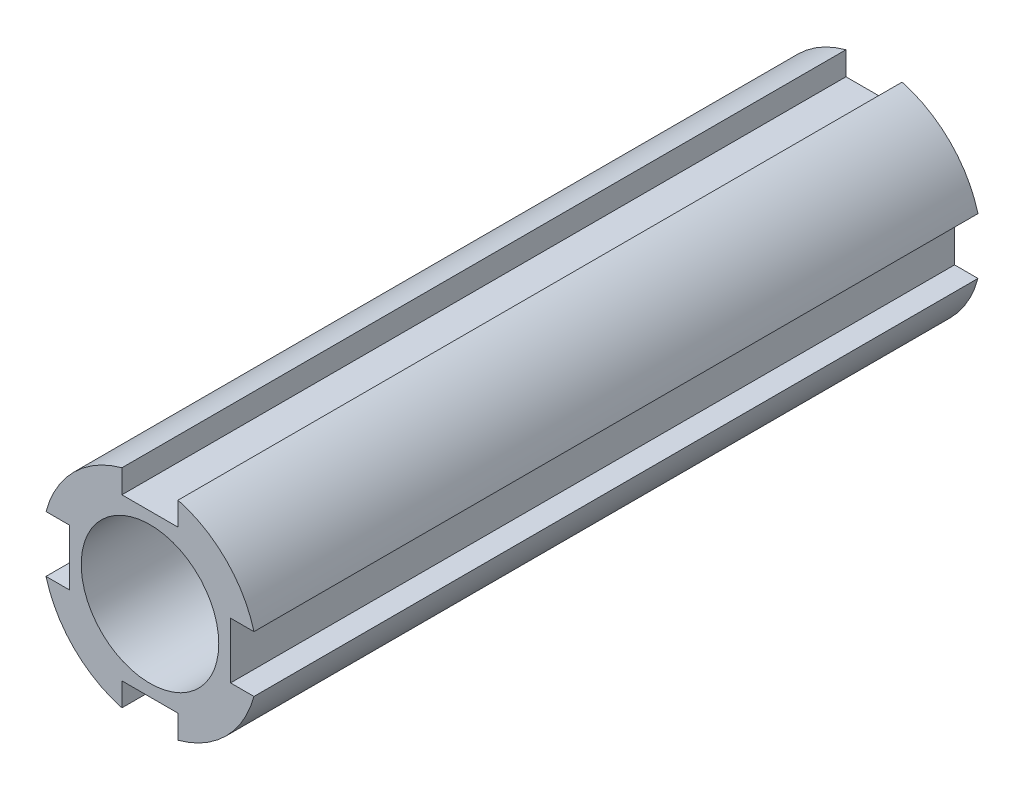
ISO-10303-21;
HEADER;
FILE_DESCRIPTION(('STEP AP214'),'2;1');
FILE_NAME('part.step','',(''),(''),'','','');
FILE_SCHEMA(('AUTOMOTIVE_DESIGN { 1 0 10303 214 1 1 1 1 }'));
ENDSEC;
DATA;
#1=APPLICATION_CONTEXT('core data for automotive mechanical design processes');
#2=APPLICATION_PROTOCOL_DEFINITION('international standard','automotive_design',2000,#1);
#3=PRODUCT_CONTEXT('',#1,'mechanical');
#4=PRODUCT('Part','Part','',(#3));
#5=PRODUCT_RELATED_PRODUCT_CATEGORY('part','',(#4));
#6=PRODUCT_DEFINITION_FORMATION('','',#4);
#7=PRODUCT_DEFINITION_CONTEXT('part definition',#1,'design');
#8=PRODUCT_DEFINITION('design','',#6,#7);
#9=PRODUCT_DEFINITION_SHAPE('','',#8);
#10=(LENGTH_UNIT() NAMED_UNIT(*) SI_UNIT(.MILLI.,.METRE.));
#11=(NAMED_UNIT(*) PLANE_ANGLE_UNIT() SI_UNIT($,.RADIAN.));
#12=(NAMED_UNIT(*) SI_UNIT($,.STERADIAN.) SOLID_ANGLE_UNIT());
#13=UNCERTAINTY_MEASURE_WITH_UNIT(LENGTH_MEASURE(1.E-05),#10,'distance_accuracy_value','');
#14=(GEOMETRIC_REPRESENTATION_CONTEXT(3) GLOBAL_UNCERTAINTY_ASSIGNED_CONTEXT((#13)) GLOBAL_UNIT_ASSIGNED_CONTEXT((#10,
#11,#12)) REPRESENTATION_CONTEXT('',''));
#15=CARTESIAN_POINT('',(0.,0.,0.));
#16=DIRECTION('',(0.,0.,1.));
#17=DIRECTION('',(1.,0.,0.));
#18=AXIS2_PLACEMENT_3D('',#15,#16,#17);
#19=CARTESIAN_POINT('',(1.1,-1.05,-20.));
#20=DIRECTION('',(1.,0.,0.));
#21=DIRECTION('',(0.,1.,0.));
#22=AXIS2_PLACEMENT_3D('',#19,#20,#21);
#23=PLANE('',#22);
#24=DIRECTION('',(0.,-1.,0.));
#25=VECTOR('',#24,1.);
#26=CARTESIAN_POINT('',(1.1,-1.05,12.));
#27=LINE('',#26,#25);
#28=CARTESIAN_POINT('',(1.1,-1.3,12.));
#29=VERTEX_POINT('',#28);
#30=CARTESIAN_POINT('',(1.1,-2.35,12.));
#31=VERTEX_POINT('',#30);
#32=EDGE_CURVE('E354',#29,#31,#27,.T.);
#33=ORIENTED_EDGE('',*,*,#32,.F.);
#34=DIRECTION('',(0.,0.,1.));
#35=VECTOR('',#34,1.);
#36=CARTESIAN_POINT('',(1.1,-1.3,-20.));
#37=LINE('',#36,#35);
#38=CARTESIAN_POINT('',(1.1,-1.3,-12.));
#39=VERTEX_POINT('',#38);
#40=EDGE_CURVE('E318',#29,#39,#37,.F.);
#41=ORIENTED_EDGE('',*,*,#40,.T.);
#42=DIRECTION('',(0.,1.,0.));
#43=VECTOR('',#42,1.);
#44=CARTESIAN_POINT('',(1.1,-1.05,-12.));
#45=LINE('',#44,#43);
#46=CARTESIAN_POINT('',(1.1,-2.35,-12.));
#47=VERTEX_POINT('',#46);
#48=EDGE_CURVE('E490',#47,#39,#45,.T.);
#49=ORIENTED_EDGE('',*,*,#48,.F.);
#50=DIRECTION('',(0.,0.,1.));
#51=VECTOR('',#50,1.);
#52=CARTESIAN_POINT('',(1.1,-2.35,-20.));
#53=LINE('',#52,#51);
#54=EDGE_CURVE('E453',#47,#31,#53,.T.);
#55=ORIENTED_EDGE('',*,*,#54,.T.);
#56=EDGE_LOOP('',(#33,#41,#49,#55));
#57=FACE_BOUND('',#56,.T.);
#58=ADVANCED_FACE('F41',(#57),#23,.F.);
#59=CARTESIAN_POINT('',(-1.,-2.35,-20.));
#60=DIRECTION('',(0.,-1.,0.));
#61=DIRECTION('',(0.,0.,-1.));
#62=AXIS2_PLACEMENT_3D('',#59,#60,#61);
#63=PLANE('',#62);
#64=DIRECTION('',(1.,0.,0.));
#65=VECTOR('',#64,1.);
#66=CARTESIAN_POINT('',(-1.,-2.35,-12.));
#67=LINE('',#66,#65);
#68=CARTESIAN_POINT('',(-1.,-2.35,-12.));
#69=VERTEX_POINT('',#68);
#70=EDGE_CURVE('E494',#69,#47,#67,.T.);
#71=ORIENTED_EDGE('',*,*,#70,.F.);
#72=DIRECTION('',(0.,0.,1.));
#73=VECTOR('',#72,1.);
#74=CARTESIAN_POINT('',(-1.,-2.35,-20.));
#75=LINE('',#74,#73);
#76=CARTESIAN_POINT('',(-1.,-2.35,12.));
#77=VERTEX_POINT('',#76);
#78=EDGE_CURVE('E456',#69,#77,#75,.T.);
#79=ORIENTED_EDGE('',*,*,#78,.T.);
#80=DIRECTION('',(-1.,0.,0.));
#81=VECTOR('',#80,1.);
#82=CARTESIAN_POINT('',(-1.,-2.35,12.));
#83=LINE('',#82,#81);
#84=EDGE_CURVE('E351',#31,#77,#83,.T.);
#85=ORIENTED_EDGE('',*,*,#84,.F.);
#86=ORIENTED_EDGE('',*,*,#54,.F.);
#87=EDGE_LOOP('',(#71,#79,#85,#86));
#88=FACE_BOUND('',#87,.T.);
#89=ADVANCED_FACE('F532',(#88),#63,.F.);
#90=CARTESIAN_POINT('',(-1.,-1.05,-20.));
#91=DIRECTION('',(-1.,0.,0.));
#92=DIRECTION('',(0.,0.,1.));
#93=AXIS2_PLACEMENT_3D('',#90,#91,#92);
#94=PLANE('',#93);
#95=DIRECTION('',(0.,-1.,0.));
#96=VECTOR('',#95,1.);
#97=CARTESIAN_POINT('',(-1.,-1.05,-12.));
#98=LINE('',#97,#96);
#99=CARTESIAN_POINT('',(-1.,-1.3,-12.));
#100=VERTEX_POINT('',#99);
#101=EDGE_CURVE('E496',#100,#69,#98,.T.);
#102=ORIENTED_EDGE('',*,*,#101,.F.);
#103=DIRECTION('',(0.,0.,1.));
#104=VECTOR('',#103,1.);
#105=CARTESIAN_POINT('',(-1.,-1.3,-20.));
#106=LINE('',#105,#104);
#107=CARTESIAN_POINT('',(-1.,-1.3,12.));
#108=VERTEX_POINT('',#107);
#109=EDGE_CURVE('E262',#100,#108,#106,.T.);
#110=ORIENTED_EDGE('',*,*,#109,.T.);
#111=DIRECTION('',(0.,1.,0.));
#112=VECTOR('',#111,1.);
#113=CARTESIAN_POINT('',(-1.,-1.05,12.));
#114=LINE('',#113,#112);
#115=EDGE_CURVE('E349',#77,#108,#114,.T.);
#116=ORIENTED_EDGE('',*,*,#115,.F.);
#117=ORIENTED_EDGE('',*,*,#78,.F.);
#118=EDGE_LOOP('',(#102,#110,#116,#117));
#119=FACE_BOUND('',#118,.T.);
#120=ADVANCED_FACE('F539',(#119),#94,.F.);
#121=CARTESIAN_POINT('',(-2.3,-1.05,-20.));
#122=DIRECTION('',(0.,-1.,0.));
#123=DIRECTION('',(0.,0.,-1.));
#124=AXIS2_PLACEMENT_3D('',#121,#122,#123);
#125=PLANE('',#124);
#126=DIRECTION('',(-1.,0.,0.));
#127=VECTOR('',#126,1.);
#128=CARTESIAN_POINT('',(-2.3,-1.05,12.));
#129=LINE('',#128,#127);
#130=CARTESIAN_POINT('',(-1.25,-1.05,12.));
#131=VERTEX_POINT('',#130);
#132=CARTESIAN_POINT('',(-2.3,-1.05,12.));
#133=VERTEX_POINT('',#132);
#134=EDGE_CURVE('E342',#131,#133,#129,.T.);
#135=ORIENTED_EDGE('',*,*,#134,.F.);
#136=DIRECTION('',(0.,0.,1.));
#137=VECTOR('',#136,1.);
#138=CARTESIAN_POINT('',(-1.25,-1.05,-20.));
#139=LINE('',#138,#137);
#140=CARTESIAN_POINT('',(-1.25,-1.05,-12.));
#141=VERTEX_POINT('',#140);
#142=EDGE_CURVE('E308',#131,#141,#139,.F.);
#143=ORIENTED_EDGE('',*,*,#142,.T.);
#144=DIRECTION('',(1.,0.,0.));
#145=VECTOR('',#144,1.);
#146=CARTESIAN_POINT('',(-2.3,-1.05,-12.));
#147=LINE('',#146,#145);
#148=CARTESIAN_POINT('',(-2.3,-1.05,-12.));
#149=VERTEX_POINT('',#148);
#150=EDGE_CURVE('E498',#149,#141,#147,.T.);
#151=ORIENTED_EDGE('',*,*,#150,.F.);
#152=DIRECTION('',(0.,0.,1.));
#153=VECTOR('',#152,1.);
#154=CARTESIAN_POINT('',(-2.3,-1.05,-20.));
#155=LINE('',#154,#153);
#156=EDGE_CURVE('E458',#149,#133,#155,.T.);
#157=ORIENTED_EDGE('',*,*,#156,.T.);
#158=EDGE_LOOP('',(#135,#143,#151,#157));
#159=FACE_BOUND('',#158,.T.);
#160=ADVANCED_FACE('F591',(#159),#125,.F.);
#161=CARTESIAN_POINT('',(-2.3,1.05,-20.));
#162=DIRECTION('',(-1.,0.,0.));
#163=DIRECTION('',(0.,-1.,0.));
#164=AXIS2_PLACEMENT_3D('',#161,#162,#163);
#165=PLANE('',#164);
#166=DIRECTION('',(0.,-1.,0.));
#167=VECTOR('',#166,1.);
#168=CARTESIAN_POINT('',(-2.3,1.05,-12.));
#169=LINE('',#168,#167);
#170=CARTESIAN_POINT('',(-2.3,1.05,-12.));
#171=VERTEX_POINT('',#170);
#172=EDGE_CURVE('E500',#171,#149,#169,.T.);
#173=ORIENTED_EDGE('',*,*,#172,.F.);
#174=DIRECTION('',(0.,0.,1.));
#175=VECTOR('',#174,1.);
#176=CARTESIAN_POINT('',(-2.3,1.05,-20.));
#177=LINE('',#176,#175);
#178=CARTESIAN_POINT('',(-2.3,1.05,12.));
#179=VERTEX_POINT('',#178);
#180=EDGE_CURVE('E461',#171,#179,#177,.T.);
#181=ORIENTED_EDGE('',*,*,#180,.T.);
#182=DIRECTION('',(0.,1.,0.));
#183=VECTOR('',#182,1.);
#184=CARTESIAN_POINT('',(-2.3,1.05,12.));
#185=LINE('',#184,#183);
#186=EDGE_CURVE('E339',#133,#179,#185,.T.);
#187=ORIENTED_EDGE('',*,*,#186,.F.);
#188=ORIENTED_EDGE('',*,*,#156,.F.);
#189=EDGE_LOOP('',(#173,#181,#187,#188));
#190=FACE_BOUND('',#189,.T.);
#191=ADVANCED_FACE('F596',(#190),#165,.F.);
#192=CARTESIAN_POINT('',(-2.3,1.05,-20.));
#193=DIRECTION('',(0.,1.,0.));
#194=DIRECTION('',(0.,0.,1.));
#195=AXIS2_PLACEMENT_3D('',#192,#193,#194);
#196=PLANE('',#195);
#197=DIRECTION('',(-1.,0.,0.));
#198=VECTOR('',#197,1.);
#199=CARTESIAN_POINT('',(-2.3,1.05,-12.));
#200=LINE('',#199,#198);
#201=CARTESIAN_POINT('',(-1.25,1.05,-12.));
#202=VERTEX_POINT('',#201);
#203=EDGE_CURVE('E332',#202,#171,#200,.T.);
#204=ORIENTED_EDGE('',*,*,#203,.F.);
#205=DIRECTION('',(0.,0.,1.));
#206=VECTOR('',#205,1.);
#207=CARTESIAN_POINT('',(-1.25,1.05,-20.));
#208=LINE('',#207,#206);
#209=CARTESIAN_POINT('',(-1.25,1.05,12.));
#210=VERTEX_POINT('',#209);
#211=EDGE_CURVE('E49',#202,#210,#208,.T.);
#212=ORIENTED_EDGE('',*,*,#211,.T.);
#213=DIRECTION('',(1.,0.,0.));
#214=VECTOR('',#213,1.);
#215=CARTESIAN_POINT('',(-2.3,1.05,12.));
#216=LINE('',#215,#214);
#217=EDGE_CURVE('E331',#179,#210,#216,.T.);
#218=ORIENTED_EDGE('',*,*,#217,.F.);
#219=ORIENTED_EDGE('',*,*,#180,.F.);
#220=EDGE_LOOP('',(#204,#212,#218,#219));
#221=FACE_BOUND('',#220,.T.);
#222=ADVANCED_FACE('F329',(#221),#196,.F.);
#223=CARTESIAN_POINT('',(-1.,2.35,-20.));
#224=DIRECTION('',(-1.,0.,0.));
#225=DIRECTION('',(0.,-1.,0.));
#226=AXIS2_PLACEMENT_3D('',#223,#224,#225);
#227=PLANE('',#226);
#228=DIRECTION('',(0.,1.,0.));
#229=VECTOR('',#228,1.);
#230=CARTESIAN_POINT('',(-1.,2.35,12.));
#231=LINE('',#230,#229);
#232=CARTESIAN_POINT('',(-1.,1.3,12.));
#233=VERTEX_POINT('',#232);
#234=CARTESIAN_POINT('',(-1.,2.35,12.));
#235=VERTEX_POINT('',#234);
#236=EDGE_CURVE('E340',#233,#235,#231,.T.);
#237=ORIENTED_EDGE('',*,*,#236,.F.);
#238=DIRECTION('',(0.,0.,1.));
#239=VECTOR('',#238,1.);
#240=CARTESIAN_POINT('',(-1.,1.3,-20.));
#241=LINE('',#240,#239);
#242=CARTESIAN_POINT('',(-1.,1.3,-12.));
#243=VERTEX_POINT('',#242);
#244=EDGE_CURVE('E11',#233,#243,#241,.F.);
#245=ORIENTED_EDGE('',*,*,#244,.T.);
#246=DIRECTION('',(0.,-1.,0.));
#247=VECTOR('',#246,1.);
#248=CARTESIAN_POINT('',(-1.,2.35,-12.));
#249=LINE('',#248,#247);
#250=CARTESIAN_POINT('',(-1.,2.35,-12.));
#251=VERTEX_POINT('',#250);
#252=EDGE_CURVE('E503',#251,#243,#249,.T.);
#253=ORIENTED_EDGE('',*,*,#252,.F.);
#254=DIRECTION('',(0.,0.,1.));
#255=VECTOR('',#254,1.);
#256=CARTESIAN_POINT('',(-1.,2.35,-20.));
#257=LINE('',#256,#255);
#258=EDGE_CURVE('E463',#251,#235,#257,.T.);
#259=ORIENTED_EDGE('',*,*,#258,.T.);
#260=EDGE_LOOP('',(#237,#245,#253,#259));
#261=FACE_BOUND('',#260,.T.);
#262=ADVANCED_FACE('F603',(#261),#227,.F.);
#263=CARTESIAN_POINT('',(-1.,2.35,-20.));
#264=DIRECTION('',(0.,1.,0.));
#265=DIRECTION('',(-1.,0.,0.));
#266=AXIS2_PLACEMENT_3D('',#263,#264,#265);
#267=PLANE('',#266);
#268=DIRECTION('',(-1.,0.,0.));
#269=VECTOR('',#268,1.);
#270=CARTESIAN_POINT('',(-1.,2.35,-12.));
#271=LINE('',#270,#269);
#272=CARTESIAN_POINT('',(1.1,2.35,-12.));
#273=VERTEX_POINT('',#272);
#274=EDGE_CURVE('E472',#273,#251,#271,.T.);
#275=ORIENTED_EDGE('',*,*,#274,.F.);
#276=DIRECTION('',(0.,0.,1.));
#277=VECTOR('',#276,1.);
#278=CARTESIAN_POINT('',(1.1,2.35,-20.));
#279=LINE('',#278,#277);
#280=CARTESIAN_POINT('',(1.1,2.35,12.));
#281=VERTEX_POINT('',#280);
#282=EDGE_CURVE('E281',#273,#281,#279,.T.);
#283=ORIENTED_EDGE('',*,*,#282,.T.);
#284=DIRECTION('',(1.,0.,0.));
#285=VECTOR('',#284,1.);
#286=CARTESIAN_POINT('',(-1.,2.35,12.));
#287=LINE('',#286,#285);
#288=EDGE_CURVE('E344',#235,#281,#287,.T.);
#289=ORIENTED_EDGE('',*,*,#288,.F.);
#290=ORIENTED_EDGE('',*,*,#258,.F.);
#291=EDGE_LOOP('',(#275,#283,#289,#290));
#292=FACE_BOUND('',#291,.T.);
#293=ADVANCED_FACE('F470',(#292),#267,.F.);
#294=CARTESIAN_POINT('',(1.1,2.35,-20.));
#295=DIRECTION('',(1.,0.,0.));
#296=DIRECTION('',(0.,1.,0.));
#297=AXIS2_PLACEMENT_3D('',#294,#295,#296);
#298=PLANE('',#297);
#299=DIRECTION('',(0.,1.,0.));
#300=VECTOR('',#299,1.);
#301=CARTESIAN_POINT('',(1.1,2.35,-12.));
#302=LINE('',#301,#300);
#303=CARTESIAN_POINT('',(1.1,1.3,-12.));
#304=VERTEX_POINT('',#303);
#305=EDGE_CURVE('E506',#304,#273,#302,.T.);
#306=ORIENTED_EDGE('',*,*,#305,.F.);
#307=DIRECTION('',(0.,0.,1.));
#308=VECTOR('',#307,1.);
#309=CARTESIAN_POINT('',(1.1,1.3,-20.));
#310=LINE('',#309,#308);
#311=CARTESIAN_POINT('',(1.1,1.3,12.));
#312=VERTEX_POINT('',#311);
#313=EDGE_CURVE('E320',#304,#312,#310,.T.);
#314=ORIENTED_EDGE('',*,*,#313,.T.);
#315=DIRECTION('',(0.,-1.,0.));
#316=VECTOR('',#315,1.);
#317=CARTESIAN_POINT('',(1.1,2.35,12.));
#318=LINE('',#317,#316);
#319=EDGE_CURVE('E477',#281,#312,#318,.T.);
#320=ORIENTED_EDGE('',*,*,#319,.F.);
#321=ORIENTED_EDGE('',*,*,#282,.F.);
#322=EDGE_LOOP('',(#306,#314,#320,#321));
#323=FACE_BOUND('',#322,.T.);
#324=ADVANCED_FACE('F478',(#323),#298,.F.);
#325=CARTESIAN_POINT('',(1.1,1.05,-20.));
#326=DIRECTION('',(0.,1.,0.));
#327=DIRECTION('',(0.,0.,1.));
#328=AXIS2_PLACEMENT_3D('',#325,#326,#327);
#329=PLANE('',#328);
#330=DIRECTION('',(1.,0.,0.));
#331=VECTOR('',#330,1.);
#332=CARTESIAN_POINT('',(1.1,1.05,12.));
#333=LINE('',#332,#331);
#334=CARTESIAN_POINT('',(1.35,1.05,12.));
#335=VERTEX_POINT('',#334);
#336=CARTESIAN_POINT('',(2.4,1.05,12.));
#337=VERTEX_POINT('',#336);
#338=EDGE_CURVE('E480',#335,#337,#333,.T.);
#339=ORIENTED_EDGE('',*,*,#338,.F.);
#340=DIRECTION('',(0.,0.,1.));
#341=VECTOR('',#340,1.);
#342=CARTESIAN_POINT('',(1.35,1.05,-20.));
#343=LINE('',#342,#341);
#344=CARTESIAN_POINT('',(1.35,1.05,-12.));
#345=VERTEX_POINT('',#344);
#346=EDGE_CURVE('E323',#335,#345,#343,.F.);
#347=ORIENTED_EDGE('',*,*,#346,.T.);
#348=DIRECTION('',(-1.,0.,0.));
#349=VECTOR('',#348,1.);
#350=CARTESIAN_POINT('',(1.1,1.05,-12.));
#351=LINE('',#350,#349);
#352=CARTESIAN_POINT('',(2.4,1.05,-12.));
#353=VERTEX_POINT('',#352);
#354=EDGE_CURVE('E273',#353,#345,#351,.T.);
#355=ORIENTED_EDGE('',*,*,#354,.F.);
#356=DIRECTION('',(0.,0.,1.));
#357=VECTOR('',#356,1.);
#358=CARTESIAN_POINT('',(2.4,1.05,-20.));
#359=LINE('',#358,#357);
#360=EDGE_CURVE('E272',#353,#337,#359,.T.);
#361=ORIENTED_EDGE('',*,*,#360,.T.);
#362=EDGE_LOOP('',(#339,#347,#355,#361));
#363=FACE_BOUND('',#362,.T.);
#364=ADVANCED_FACE('F576',(#363),#329,.F.);
#365=CARTESIAN_POINT('',(2.4,1.05,-20.));
#366=DIRECTION('',(1.,0.,0.));
#367=DIRECTION('',(0.,1.,0.));
#368=AXIS2_PLACEMENT_3D('',#365,#366,#367);
#369=PLANE('',#368);
#370=DIRECTION('',(0.,1.,0.));
#371=VECTOR('',#370,1.);
#372=CARTESIAN_POINT('',(2.4,1.05,-12.));
#373=LINE('',#372,#371);
#374=CARTESIAN_POINT('',(2.4,-1.05,-12.));
#375=VERTEX_POINT('',#374);
#376=EDGE_CURVE('E253',#375,#353,#373,.T.);
#377=ORIENTED_EDGE('',*,*,#376,.F.);
#378=DIRECTION('',(0.,0.,1.));
#379=VECTOR('',#378,1.);
#380=CARTESIAN_POINT('',(2.4,-1.05,-20.));
#381=LINE('',#380,#379);
#382=CARTESIAN_POINT('',(2.4,-1.05,12.));
#383=VERTEX_POINT('',#382);
#384=EDGE_CURVE('E269',#375,#383,#381,.T.);
#385=ORIENTED_EDGE('',*,*,#384,.T.);
#386=DIRECTION('',(0.,-1.,0.));
#387=VECTOR('',#386,1.);
#388=CARTESIAN_POINT('',(2.4,1.05,12.));
#389=LINE('',#388,#387);
#390=EDGE_CURVE('E482',#337,#383,#389,.T.);
#391=ORIENTED_EDGE('',*,*,#390,.F.);
#392=ORIENTED_EDGE('',*,*,#360,.F.);
#393=EDGE_LOOP('',(#377,#385,#391,#392));
#394=FACE_BOUND('',#393,.T.);
#395=ADVANCED_FACE('F267',(#394),#369,.F.);
#396=CARTESIAN_POINT('',(1.1,-1.05,-20.));
#397=DIRECTION('',(0.,-1.,0.));
#398=DIRECTION('',(0.,0.,-1.));
#399=AXIS2_PLACEMENT_3D('',#396,#397,#398);
#400=PLANE('',#399);
#401=DIRECTION('',(1.,0.,0.));
#402=VECTOR('',#401,1.);
#403=CARTESIAN_POINT('',(1.1,-1.05,-12.));
#404=LINE('',#403,#402);
#405=CARTESIAN_POINT('',(1.35,-1.05,-12.));
#406=VERTEX_POINT('',#405);
#407=EDGE_CURVE('E248',#406,#375,#404,.T.);
#408=ORIENTED_EDGE('',*,*,#407,.F.);
#409=DIRECTION('',(0.,0.,1.));
#410=VECTOR('',#409,1.);
#411=CARTESIAN_POINT('',(1.35,-1.05,-20.));
#412=LINE('',#411,#410);
#413=CARTESIAN_POINT('',(1.35,-1.05,12.));
#414=VERTEX_POINT('',#413);
#415=EDGE_CURVE('E316',#406,#414,#412,.T.);
#416=ORIENTED_EDGE('',*,*,#415,.T.);
#417=DIRECTION('',(-1.,0.,0.));
#418=VECTOR('',#417,1.);
#419=CARTESIAN_POINT('',(1.1,-1.05,12.));
#420=LINE('',#419,#418);
#421=EDGE_CURVE('E263',#383,#414,#420,.T.);
#422=ORIENTED_EDGE('',*,*,#421,.F.);
#423=ORIENTED_EDGE('',*,*,#384,.F.);
#424=EDGE_LOOP('',(#408,#416,#422,#423));
#425=FACE_BOUND('',#424,.T.);
#426=ADVANCED_FACE('F277',(#425),#400,.F.);
#427=CARTESIAN_POINT('',(0.,0.,20.));
#428=DIRECTION('',(0.,0.,-1.));
#429=DIRECTION('',(-1.,0.,0.));
#430=AXIS2_PLACEMENT_3D('',#427,#428,#429);
#431=CYLINDRICAL_SURFACE('',#430,5.95);
#432=DIRECTION('',(0.,0.,1.));
#433=VECTOR('',#432,1.);
#434=CARTESIAN_POINT('',(1.55,5.74456264653803,-20.));
#435=LINE('',#434,#433);
#436=CARTESIAN_POINT('',(1.55,5.74456264653803,-20.));
#437=VERTEX_POINT('',#436);
#438=CARTESIAN_POINT('',(1.55,5.74456264653803,20.));
#439=VERTEX_POINT('',#438);
#440=EDGE_CURVE('E366',#437,#439,#435,.T.);
#441=ORIENTED_EDGE('',*,*,#440,.T.);
#442=CARTESIAN_POINT('',(0.,0.,20.));
#443=DIRECTION('',(0.,0.,1.));
#444=DIRECTION('',(1.,0.,0.));
#445=AXIS2_PLACEMENT_3D('',#442,#443,#444);
#446=CIRCLE('',#445,5.95);
#447=CARTESIAN_POINT('',(5.74456264653803,1.55,20.));
#448=VERTEX_POINT('',#447);
#449=EDGE_CURVE('E287',#448,#439,#446,.T.);
#450=ORIENTED_EDGE('',*,*,#449,.F.);
#451=DIRECTION('',(0.,0.,1.));
#452=VECTOR('',#451,1.);
#453=CARTESIAN_POINT('',(5.74456264653803,1.55,-20.));
#454=LINE('',#453,#452);
#455=CARTESIAN_POINT('',(5.74456264653803,1.55,-20.));
#456=VERTEX_POINT('',#455);
#457=EDGE_CURVE('E400',#456,#448,#454,.T.);
#458=ORIENTED_EDGE('',*,*,#457,.F.);
#459=CARTESIAN_POINT('',(0.,0.,-20.));
#460=DIRECTION('',(0.,0.,1.));
#461=DIRECTION('',(1.,0.,0.));
#462=AXIS2_PLACEMENT_3D('',#459,#460,#461);
#463=CIRCLE('',#462,5.95);
#464=EDGE_CURVE('E292',#456,#437,#463,.T.);
#465=ORIENTED_EDGE('',*,*,#464,.T.);
#466=EDGE_LOOP('',(#441,#450,#458,#465));
#467=FACE_BOUND('',#466,.T.);
#468=ADVANCED_FACE('F556',(#467),#431,.T.);
#469=CARTESIAN_POINT('',(-1.55,5.74456264653803,20.));
#470=VERTEX_POINT('',#469);
#471=CARTESIAN_POINT('',(-5.74456264653803,1.55,20.));
#472=VERTEX_POINT('',#471);
#473=EDGE_CURVE('E290',#470,#472,#446,.T.);
#474=ORIENTED_EDGE('',*,*,#473,.F.);
#475=DIRECTION('',(0.,0.,1.));
#476=VECTOR('',#475,1.);
#477=CARTESIAN_POINT('',(-1.55,5.74456264653803,-20.));
#478=LINE('',#477,#476);
#479=CARTESIAN_POINT('',(-1.55,5.74456264653803,-20.));
#480=VERTEX_POINT('',#479);
#481=EDGE_CURVE('E377',#480,#470,#478,.T.);
#482=ORIENTED_EDGE('',*,*,#481,.F.);
#483=CARTESIAN_POINT('',(-5.74456264653803,1.55,-20.));
#484=VERTEX_POINT('',#483);
#485=EDGE_CURVE('E295',#480,#484,#463,.T.);
#486=ORIENTED_EDGE('',*,*,#485,.T.);
#487=DIRECTION('',(0.,0.,1.));
#488=VECTOR('',#487,1.);
#489=CARTESIAN_POINT('',(-5.74456264653803,1.55,-20.));
#490=LINE('',#489,#488);
#491=EDGE_CURVE('E427',#484,#472,#490,.T.);
#492=ORIENTED_EDGE('',*,*,#491,.T.);
#493=EDGE_LOOP('',(#474,#482,#486,#492));
#494=FACE_BOUND('',#493,.T.);
#495=ADVANCED_FACE('F559',(#494),#431,.T.);
#496=CARTESIAN_POINT('',(1.55,-5.74456264653803,-20.));
#497=VERTEX_POINT('',#496);
#498=CARTESIAN_POINT('',(5.74456264653803,-1.55,-20.));
#499=VERTEX_POINT('',#498);
#500=EDGE_CURVE('E296',#497,#499,#463,.T.);
#501=ORIENTED_EDGE('',*,*,#500,.T.);
#502=DIRECTION('',(0.,0.,1.));
#503=VECTOR('',#502,1.);
#504=CARTESIAN_POINT('',(5.74456264653803,-1.55,-20.));
#505=LINE('',#504,#503);
#506=CARTESIAN_POINT('',(5.74456264653803,-1.55,20.));
#507=VERTEX_POINT('',#506);
#508=EDGE_CURVE('E402',#499,#507,#505,.T.);
#509=ORIENTED_EDGE('',*,*,#508,.T.);
#510=CARTESIAN_POINT('',(1.55,-5.74456264653803,20.));
#511=VERTEX_POINT('',#510);
#512=EDGE_CURVE('E291',#511,#507,#446,.T.);
#513=ORIENTED_EDGE('',*,*,#512,.F.);
#514=DIRECTION('',(0.,0.,1.));
#515=VECTOR('',#514,1.);
#516=CARTESIAN_POINT('',(1.55,-5.74456264653803,-20.));
#517=LINE('',#516,#515);
#518=EDGE_CURVE('E419',#497,#511,#517,.T.);
#519=ORIENTED_EDGE('',*,*,#518,.F.);
#520=EDGE_LOOP('',(#501,#509,#513,#519));
#521=FACE_BOUND('',#520,.T.);
#522=ADVANCED_FACE('F711',(#521),#431,.T.);
#523=CARTESIAN_POINT('',(-5.74456264653803,-1.55,20.));
#524=VERTEX_POINT('',#523);
#525=CARTESIAN_POINT('',(-1.55,-5.74456264653803,20.));
#526=VERTEX_POINT('',#525);
#527=EDGE_CURVE('E893',#524,#526,#446,.T.);
#528=ORIENTED_EDGE('',*,*,#527,.F.);
#529=DIRECTION('',(0.,0.,1.));
#530=VECTOR('',#529,1.);
#531=CARTESIAN_POINT('',(-5.74456264653803,-1.55,-20.));
#532=LINE('',#531,#530);
#533=CARTESIAN_POINT('',(-5.74456264653803,-1.55,-20.));
#534=VERTEX_POINT('',#533);
#535=EDGE_CURVE('E425',#534,#524,#532,.T.);
#536=ORIENTED_EDGE('',*,*,#535,.F.);
#537=CARTESIAN_POINT('',(-1.55,-5.74456264653803,-20.));
#538=VERTEX_POINT('',#537);
#539=EDGE_CURVE('E914',#534,#538,#463,.T.);
#540=ORIENTED_EDGE('',*,*,#539,.T.);
#541=DIRECTION('',(0.,0.,1.));
#542=VECTOR('',#541,1.);
#543=CARTESIAN_POINT('',(-1.55,-5.74456264653803,-20.));
#544=LINE('',#543,#542);
#545=EDGE_CURVE('E447',#538,#526,#544,.T.);
#546=ORIENTED_EDGE('',*,*,#545,.T.);
#547=EDGE_LOOP('',(#528,#536,#540,#546));
#548=FACE_BOUND('',#547,.T.);
#549=ADVANCED_FACE('F550',(#548),#431,.T.);
#550=CARTESIAN_POINT('',(0.,0.,20.));
#551=DIRECTION('',(0.,0.,1.));
#552=DIRECTION('',(1.,0.,0.));
#553=AXIS2_PLACEMENT_3D('',#550,#551,#552);
#554=PLANE('',#553);
#555=CARTESIAN_POINT('',(0.,0.,20.));
#556=DIRECTION('',(0.,0.,1.));
#557=DIRECTION('',(1.,0.,0.));
#558=AXIS2_PLACEMENT_3D('',#555,#556,#557);
#559=CIRCLE('',#558,3.8);
#560=CARTESIAN_POINT('',(3.8,0.,20.));
#561=VERTEX_POINT('',#560);
#562=EDGE_CURVE('E487',#561,#561,#559,.T.);
#563=ORIENTED_EDGE('',*,*,#562,.F.);
#564=EDGE_LOOP('',(#563));
#565=FACE_BOUND('',#564,.T.);
#566=ORIENTED_EDGE('',*,*,#449,.T.);
#567=DIRECTION('',(0.,-1.,0.));
#568=VECTOR('',#567,1.);
#569=CARTESIAN_POINT('',(1.55,0.,20.));
#570=LINE('',#569,#568);
#571=CARTESIAN_POINT('',(1.55,4.45,20.));
#572=VERTEX_POINT('',#571);
#573=EDGE_CURVE('E367',#439,#572,#570,.T.);
#574=ORIENTED_EDGE('',*,*,#573,.T.);
#575=DIRECTION('',(1.,0.,0.));
#576=VECTOR('',#575,1.);
#577=CARTESIAN_POINT('',(0.,4.45,20.));
#578=LINE('',#577,#576);
#579=CARTESIAN_POINT('',(-1.55,4.45,20.));
#580=VERTEX_POINT('',#579);
#581=EDGE_CURVE('E360',#580,#572,#578,.T.);
#582=ORIENTED_EDGE('',*,*,#581,.F.);
#583=DIRECTION('',(0.,-1.,0.));
#584=VECTOR('',#583,1.);
#585=CARTESIAN_POINT('',(-1.55,0.,20.));
#586=LINE('',#585,#584);
#587=EDGE_CURVE('E370',#470,#580,#586,.T.);
#588=ORIENTED_EDGE('',*,*,#587,.F.);
#589=ORIENTED_EDGE('',*,*,#473,.T.);
#590=DIRECTION('',(1.,0.,0.));
#591=VECTOR('',#590,1.);
#592=CARTESIAN_POINT('',(0.,1.55,20.));
#593=LINE('',#592,#591);
#594=CARTESIAN_POINT('',(-4.45,1.55,20.));
#595=VERTEX_POINT('',#594);
#596=EDGE_CURVE('E418',#472,#595,#593,.T.);
#597=ORIENTED_EDGE('',*,*,#596,.T.);
#598=DIRECTION('',(0.,-1.,0.));
#599=VECTOR('',#598,1.);
#600=CARTESIAN_POINT('',(-4.45,0.,20.));
#601=LINE('',#600,#599);
#602=CARTESIAN_POINT('',(-4.45,-1.55,20.));
#603=VERTEX_POINT('',#602);
#604=EDGE_CURVE('E415',#595,#603,#601,.T.);
#605=ORIENTED_EDGE('',*,*,#604,.T.);
#606=DIRECTION('',(1.,0.,0.));
#607=VECTOR('',#606,1.);
#608=CARTESIAN_POINT('',(0.,-1.55,20.));
#609=LINE('',#608,#607);
#610=EDGE_CURVE('E409',#524,#603,#609,.T.);
#611=ORIENTED_EDGE('',*,*,#610,.F.);
#612=ORIENTED_EDGE('',*,*,#527,.T.);
#613=DIRECTION('',(0.,-1.,0.));
#614=VECTOR('',#613,1.);
#615=CARTESIAN_POINT('',(-1.55,0.,20.));
#616=LINE('',#615,#614);
#617=CARTESIAN_POINT('',(-1.55,-4.45,20.));
#618=VERTEX_POINT('',#617);
#619=EDGE_CURVE('E434',#618,#526,#616,.T.);
#620=ORIENTED_EDGE('',*,*,#619,.F.);
#621=DIRECTION('',(1.,0.,0.));
#622=VECTOR('',#621,1.);
#623=CARTESIAN_POINT('',(0.,-4.45,20.));
#624=LINE('',#623,#622);
#625=CARTESIAN_POINT('',(1.55,-4.45,20.));
#626=VERTEX_POINT('',#625);
#627=EDGE_CURVE('E442',#618,#626,#624,.T.);
#628=ORIENTED_EDGE('',*,*,#627,.T.);
#629=DIRECTION('',(0.,-1.,0.));
#630=VECTOR('',#629,1.);
#631=CARTESIAN_POINT('',(1.55,0.,20.));
#632=LINE('',#631,#630);
#633=EDGE_CURVE('E356',#626,#511,#632,.T.);
#634=ORIENTED_EDGE('',*,*,#633,.T.);
#635=ORIENTED_EDGE('',*,*,#512,.T.);
#636=DIRECTION('',(1.,0.,0.));
#637=VECTOR('',#636,1.);
#638=CARTESIAN_POINT('',(0.,-1.55,20.));
#639=LINE('',#638,#637);
#640=CARTESIAN_POINT('',(4.45,-1.55,20.));
#641=VERTEX_POINT('',#640);
#642=EDGE_CURVE('E394',#641,#507,#639,.T.);
#643=ORIENTED_EDGE('',*,*,#642,.F.);
#644=DIRECTION('',(0.,-1.,0.));
#645=VECTOR('',#644,1.);
#646=CARTESIAN_POINT('',(4.45,0.,20.));
#647=LINE('',#646,#645);
#648=CARTESIAN_POINT('',(4.45,1.55,20.));
#649=VERTEX_POINT('',#648);
#650=EDGE_CURVE('E391',#649,#641,#647,.T.);
#651=ORIENTED_EDGE('',*,*,#650,.F.);
#652=DIRECTION('',(1.,0.,0.));
#653=VECTOR('',#652,1.);
#654=CARTESIAN_POINT('',(0.,1.55,20.));
#655=LINE('',#654,#653);
#656=EDGE_CURVE('E385',#649,#448,#655,.T.);
#657=ORIENTED_EDGE('',*,*,#656,.T.);
#658=EDGE_LOOP('',(#566,#574,#582,#588,#589,#597,#605,#611,#612,#620,#628,#634,#635,#643,#651,#657));
#659=FACE_BOUND('',#658,.T.);
#660=ADVANCED_FACE('F546',(#565,#659),#554,.T.);
#661=CARTESIAN_POINT('',(0.,0.,-20.));
#662=DIRECTION('',(0.,0.,1.));
#663=DIRECTION('',(1.,0.,0.));
#664=AXIS2_PLACEMENT_3D('',#661,#662,#663);
#665=PLANE('',#664);
#666=CARTESIAN_POINT('',(0.,0.,-20.));
#667=DIRECTION('',(0.,0.,1.));
#668=DIRECTION('',(1.,0.,0.));
#669=AXIS2_PLACEMENT_3D('',#666,#667,#668);
#670=CIRCLE('',#669,3.8);
#671=CARTESIAN_POINT('',(3.8,0.,-20.));
#672=VERTEX_POINT('',#671);
#673=EDGE_CURVE('E509',#672,#672,#670,.T.);
#674=ORIENTED_EDGE('',*,*,#673,.T.);
#675=EDGE_LOOP('',(#674));
#676=FACE_BOUND('',#675,.T.);
#677=DIRECTION('',(0.,-1.,0.));
#678=VECTOR('',#677,1.);
#679=CARTESIAN_POINT('',(1.55,0.,-20.));
#680=LINE('',#679,#678);
#681=CARTESIAN_POINT('',(1.55,4.45,-20.));
#682=VERTEX_POINT('',#681);
#683=EDGE_CURVE('E357',#437,#682,#680,.T.);
#684=ORIENTED_EDGE('',*,*,#683,.F.);
#685=ORIENTED_EDGE('',*,*,#464,.F.);
#686=DIRECTION('',(1.,0.,0.));
#687=VECTOR('',#686,1.);
#688=CARTESIAN_POINT('',(0.,1.55,-20.));
#689=LINE('',#688,#687);
#690=CARTESIAN_POINT('',(4.45,1.55,-20.));
#691=VERTEX_POINT('',#690);
#692=EDGE_CURVE('E388',#691,#456,#689,.T.);
#693=ORIENTED_EDGE('',*,*,#692,.F.);
#694=DIRECTION('',(0.,-1.,0.));
#695=VECTOR('',#694,1.);
#696=CARTESIAN_POINT('',(4.45,0.,-20.));
#697=LINE('',#696,#695);
#698=CARTESIAN_POINT('',(4.45,-1.55,-20.));
#699=VERTEX_POINT('',#698);
#700=EDGE_CURVE('E381',#691,#699,#697,.T.);
#701=ORIENTED_EDGE('',*,*,#700,.T.);
#702=DIRECTION('',(1.,0.,0.));
#703=VECTOR('',#702,1.);
#704=CARTESIAN_POINT('',(0.,-1.55,-20.));
#705=LINE('',#704,#703);
#706=EDGE_CURVE('E384',#699,#499,#705,.T.);
#707=ORIENTED_EDGE('',*,*,#706,.T.);
#708=ORIENTED_EDGE('',*,*,#500,.F.);
#709=DIRECTION('',(0.,-1.,0.));
#710=VECTOR('',#709,1.);
#711=CARTESIAN_POINT('',(1.55,0.,-20.));
#712=LINE('',#711,#710);
#713=CARTESIAN_POINT('',(1.55,-4.45,-20.));
#714=VERTEX_POINT('',#713);
#715=EDGE_CURVE('E431',#714,#497,#712,.T.);
#716=ORIENTED_EDGE('',*,*,#715,.F.);
#717=DIRECTION('',(1.,0.,0.));
#718=VECTOR('',#717,1.);
#719=CARTESIAN_POINT('',(0.,-4.45,-20.));
#720=LINE('',#719,#718);
#721=CARTESIAN_POINT('',(-1.55,-4.45,-20.));
#722=VERTEX_POINT('',#721);
#723=EDGE_CURVE('E433',#722,#714,#720,.T.);
#724=ORIENTED_EDGE('',*,*,#723,.F.);
#725=DIRECTION('',(0.,-1.,0.));
#726=VECTOR('',#725,1.);
#727=CARTESIAN_POINT('',(-1.55,0.,-20.));
#728=LINE('',#727,#726);
#729=EDGE_CURVE('E436',#722,#538,#728,.T.);
#730=ORIENTED_EDGE('',*,*,#729,.T.);
#731=ORIENTED_EDGE('',*,*,#539,.F.);
#732=DIRECTION('',(1.,0.,0.));
#733=VECTOR('',#732,1.);
#734=CARTESIAN_POINT('',(0.,-1.55,-20.));
#735=LINE('',#734,#733);
#736=CARTESIAN_POINT('',(-4.45,-1.55,-20.));
#737=VERTEX_POINT('',#736);
#738=EDGE_CURVE('E411',#534,#737,#735,.T.);
#739=ORIENTED_EDGE('',*,*,#738,.T.);
#740=DIRECTION('',(0.,-1.,0.));
#741=VECTOR('',#740,1.);
#742=CARTESIAN_POINT('',(-4.45,0.,-20.));
#743=LINE('',#742,#741);
#744=CARTESIAN_POINT('',(-4.45,1.55,-20.));
#745=VERTEX_POINT('',#744);
#746=EDGE_CURVE('E406',#745,#737,#743,.T.);
#747=ORIENTED_EDGE('',*,*,#746,.F.);
#748=DIRECTION('',(1.,0.,0.));
#749=VECTOR('',#748,1.);
#750=CARTESIAN_POINT('',(0.,1.55,-20.));
#751=LINE('',#750,#749);
#752=EDGE_CURVE('E408',#484,#745,#751,.T.);
#753=ORIENTED_EDGE('',*,*,#752,.F.);
#754=ORIENTED_EDGE('',*,*,#485,.F.);
#755=DIRECTION('',(0.,-1.,0.));
#756=VECTOR('',#755,1.);
#757=CARTESIAN_POINT('',(-1.55,0.,-20.));
#758=LINE('',#757,#756);
#759=CARTESIAN_POINT('',(-1.55,4.45,-20.));
#760=VERTEX_POINT('',#759);
#761=EDGE_CURVE('E359',#480,#760,#758,.T.);
#762=ORIENTED_EDGE('',*,*,#761,.T.);
#763=DIRECTION('',(1.,0.,0.));
#764=VECTOR('',#763,1.);
#765=CARTESIAN_POINT('',(0.,4.45,-20.));
#766=LINE('',#765,#764);
#767=EDGE_CURVE('E363',#760,#682,#766,.T.);
#768=ORIENTED_EDGE('',*,*,#767,.T.);
#769=EDGE_LOOP('',(#684,#685,#693,#701,#707,#708,#716,#724,#730,#731,#739,#747,#753,#754,#762,#768));
#770=FACE_BOUND('',#769,.T.);
#771=ADVANCED_FACE('F549',(#676,#770),#665,.F.);
#772=CARTESIAN_POINT('',(1.55,0.,-20.));
#773=DIRECTION('',(-1.,0.,0.));
#774=DIRECTION('',(0.,0.,1.));
#775=AXIS2_PLACEMENT_3D('',#772,#773,#774);
#776=PLANE('',#775);
#777=ORIENTED_EDGE('',*,*,#633,.F.);
#778=DIRECTION('',(0.,0.,1.));
#779=VECTOR('',#778,1.);
#780=CARTESIAN_POINT('',(1.55,-4.45,-20.));
#781=LINE('',#780,#779);
#782=EDGE_CURVE('E439',#714,#626,#781,.T.);
#783=ORIENTED_EDGE('',*,*,#782,.F.);
#784=ORIENTED_EDGE('',*,*,#715,.T.);
#785=ORIENTED_EDGE('',*,*,#518,.T.);
#786=EDGE_LOOP('',(#777,#783,#784,#785));
#787=FACE_BOUND('',#786,.T.);
#788=ADVANCED_FACE('F554',(#787),#776,.T.);
#789=CARTESIAN_POINT('',(-1.55,0.,-20.));
#790=DIRECTION('',(-1.,0.,0.));
#791=DIRECTION('',(0.,0.,1.));
#792=AXIS2_PLACEMENT_3D('',#789,#790,#791);
#793=PLANE('',#792);
#794=ORIENTED_EDGE('',*,*,#619,.T.);
#795=ORIENTED_EDGE('',*,*,#545,.F.);
#796=ORIENTED_EDGE('',*,*,#729,.F.);
#797=DIRECTION('',(0.,0.,1.));
#798=VECTOR('',#797,1.);
#799=CARTESIAN_POINT('',(-1.55,-4.45,-20.));
#800=LINE('',#799,#798);
#801=EDGE_CURVE('E450',#722,#618,#800,.T.);
#802=ORIENTED_EDGE('',*,*,#801,.T.);
#803=EDGE_LOOP('',(#794,#795,#796,#802));
#804=FACE_BOUND('',#803,.T.);
#805=ADVANCED_FACE('F739',(#804),#793,.F.);
#806=CARTESIAN_POINT('',(0.,-4.45,-20.));
#807=DIRECTION('',(0.,-1.,0.));
#808=DIRECTION('',(0.,0.,-1.));
#809=AXIS2_PLACEMENT_3D('',#806,#807,#808);
#810=PLANE('',#809);
#811=ORIENTED_EDGE('',*,*,#627,.F.);
#812=ORIENTED_EDGE('',*,*,#801,.F.);
#813=ORIENTED_EDGE('',*,*,#723,.T.);
#814=ORIENTED_EDGE('',*,*,#782,.T.);
#815=EDGE_LOOP('',(#811,#812,#813,#814));
#816=FACE_BOUND('',#815,.T.);
#817=ADVANCED_FACE('F748',(#816),#810,.T.);
#818=CARTESIAN_POINT('',(-4.45,0.,-20.));
#819=DIRECTION('',(-1.,0.,0.));
#820=DIRECTION('',(0.,0.,1.));
#821=AXIS2_PLACEMENT_3D('',#818,#819,#820);
#822=PLANE('',#821);
#823=ORIENTED_EDGE('',*,*,#604,.F.);
#824=DIRECTION('',(0.,0.,1.));
#825=VECTOR('',#824,1.);
#826=CARTESIAN_POINT('',(-4.45,1.55,-20.));
#827=LINE('',#826,#825);
#828=EDGE_CURVE('E414',#745,#595,#827,.T.);
#829=ORIENTED_EDGE('',*,*,#828,.F.);
#830=ORIENTED_EDGE('',*,*,#746,.T.);
#831=DIRECTION('',(0.,0.,1.));
#832=VECTOR('',#831,1.);
#833=CARTESIAN_POINT('',(-4.45,-1.55,-20.));
#834=LINE('',#833,#832);
#835=EDGE_CURVE('E395',#737,#603,#834,.T.);
#836=ORIENTED_EDGE('',*,*,#835,.T.);
#837=EDGE_LOOP('',(#823,#829,#830,#836));
#838=FACE_BOUND('',#837,.T.);
#839=ADVANCED_FACE('F757',(#838),#822,.T.);
#840=CARTESIAN_POINT('',(0.,-1.55,-20.));
#841=DIRECTION('',(0.,-1.,0.));
#842=DIRECTION('',(0.,0.,-1.));
#843=AXIS2_PLACEMENT_3D('',#840,#841,#842);
#844=PLANE('',#843);
#845=ORIENTED_EDGE('',*,*,#610,.T.);
#846=ORIENTED_EDGE('',*,*,#835,.F.);
#847=ORIENTED_EDGE('',*,*,#738,.F.);
#848=ORIENTED_EDGE('',*,*,#535,.T.);
#849=EDGE_LOOP('',(#845,#846,#847,#848));
#850=FACE_BOUND('',#849,.T.);
#851=ADVANCED_FACE('F766',(#850),#844,.F.);
#852=CARTESIAN_POINT('',(0.,1.55,-20.));
#853=DIRECTION('',(0.,-1.,0.));
#854=DIRECTION('',(0.,0.,-1.));
#855=AXIS2_PLACEMENT_3D('',#852,#853,#854);
#856=PLANE('',#855);
#857=ORIENTED_EDGE('',*,*,#596,.F.);
#858=ORIENTED_EDGE('',*,*,#491,.F.);
#859=ORIENTED_EDGE('',*,*,#752,.T.);
#860=ORIENTED_EDGE('',*,*,#828,.T.);
#861=EDGE_LOOP('',(#857,#858,#859,#860));
#862=FACE_BOUND('',#861,.T.);
#863=ADVANCED_FACE('F775',(#862),#856,.T.);
#864=CARTESIAN_POINT('',(4.45,0.,-20.));
#865=DIRECTION('',(-1.,0.,0.));
#866=DIRECTION('',(0.,0.,1.));
#867=AXIS2_PLACEMENT_3D('',#864,#865,#866);
#868=PLANE('',#867);
#869=ORIENTED_EDGE('',*,*,#650,.T.);
#870=DIRECTION('',(0.,0.,1.));
#871=VECTOR('',#870,1.);
#872=CARTESIAN_POINT('',(4.45,-1.55,-20.));
#873=LINE('',#872,#871);
#874=EDGE_CURVE('E390',#699,#641,#873,.T.);
#875=ORIENTED_EDGE('',*,*,#874,.F.);
#876=ORIENTED_EDGE('',*,*,#700,.F.);
#877=DIRECTION('',(0.,0.,1.));
#878=VECTOR('',#877,1.);
#879=CARTESIAN_POINT('',(4.45,1.55,-20.));
#880=LINE('',#879,#878);
#881=EDGE_CURVE('E371',#691,#649,#880,.T.);
#882=ORIENTED_EDGE('',*,*,#881,.T.);
#883=EDGE_LOOP('',(#869,#875,#876,#882));
#884=FACE_BOUND('',#883,.T.);
#885=ADVANCED_FACE('F784',(#884),#868,.F.);
#886=CARTESIAN_POINT('',(0.,1.55,-20.));
#887=DIRECTION('',(0.,-1.,0.));
#888=DIRECTION('',(0.,0.,-1.));
#889=AXIS2_PLACEMENT_3D('',#886,#887,#888);
#890=PLANE('',#889);
#891=ORIENTED_EDGE('',*,*,#656,.F.);
#892=ORIENTED_EDGE('',*,*,#881,.F.);
#893=ORIENTED_EDGE('',*,*,#692,.T.);
#894=ORIENTED_EDGE('',*,*,#457,.T.);
#895=EDGE_LOOP('',(#891,#892,#893,#894));
#896=FACE_BOUND('',#895,.T.);
#897=ADVANCED_FACE('F793',(#896),#890,.T.);
#898=CARTESIAN_POINT('',(0.,-1.55,-20.));
#899=DIRECTION('',(0.,-1.,0.));
#900=DIRECTION('',(0.,0.,-1.));
#901=AXIS2_PLACEMENT_3D('',#898,#899,#900);
#902=PLANE('',#901);
#903=ORIENTED_EDGE('',*,*,#642,.T.);
#904=ORIENTED_EDGE('',*,*,#508,.F.);
#905=ORIENTED_EDGE('',*,*,#706,.F.);
#906=ORIENTED_EDGE('',*,*,#874,.T.);
#907=EDGE_LOOP('',(#903,#904,#905,#906));
#908=FACE_BOUND('',#907,.T.);
#909=ADVANCED_FACE('F802',(#908),#902,.F.);
#910=CARTESIAN_POINT('',(1.55,0.,-20.));
#911=DIRECTION('',(-1.,0.,0.));
#912=DIRECTION('',(0.,-1.,0.));
#913=AXIS2_PLACEMENT_3D('',#910,#911,#912);
#914=PLANE('',#913);
#915=ORIENTED_EDGE('',*,*,#573,.F.);
#916=ORIENTED_EDGE('',*,*,#440,.F.);
#917=ORIENTED_EDGE('',*,*,#683,.T.);
#918=DIRECTION('',(0.,0.,1.));
#919=VECTOR('',#918,1.);
#920=CARTESIAN_POINT('',(1.55,4.45,-20.));
#921=LINE('',#920,#919);
#922=EDGE_CURVE('E279',#682,#572,#921,.T.);
#923=ORIENTED_EDGE('',*,*,#922,.T.);
#924=EDGE_LOOP('',(#915,#916,#917,#923));
#925=FACE_BOUND('',#924,.T.);
#926=ADVANCED_FACE('F811',(#925),#914,.T.);
#927=CARTESIAN_POINT('',(0.,4.45,-20.));
#928=DIRECTION('',(0.,-1.,0.));
#929=DIRECTION('',(0.,0.,-1.));
#930=AXIS2_PLACEMENT_3D('',#927,#928,#929);
#931=PLANE('',#930);
#932=ORIENTED_EDGE('',*,*,#581,.T.);
#933=ORIENTED_EDGE('',*,*,#922,.F.);
#934=ORIENTED_EDGE('',*,*,#767,.F.);
#935=DIRECTION('',(0.,0.,1.));
#936=VECTOR('',#935,1.);
#937=CARTESIAN_POINT('',(-1.55,4.45,-20.));
#938=LINE('',#937,#936);
#939=EDGE_CURVE('E283',#760,#580,#938,.T.);
#940=ORIENTED_EDGE('',*,*,#939,.T.);
#941=EDGE_LOOP('',(#932,#933,#934,#940));
#942=FACE_BOUND('',#941,.T.);
#943=ADVANCED_FACE('F820',(#942),#931,.F.);
#944=CARTESIAN_POINT('',(-1.55,0.,-20.));
#945=DIRECTION('',(-1.,0.,0.));
#946=DIRECTION('',(0.,-1.,0.));
#947=AXIS2_PLACEMENT_3D('',#944,#945,#946);
#948=PLANE('',#947);
#949=ORIENTED_EDGE('',*,*,#587,.T.);
#950=ORIENTED_EDGE('',*,*,#939,.F.);
#951=ORIENTED_EDGE('',*,*,#761,.F.);
#952=ORIENTED_EDGE('',*,*,#481,.T.);
#953=EDGE_LOOP('',(#949,#950,#951,#952));
#954=FACE_BOUND('',#953,.T.);
#955=ADVANCED_FACE('F629',(#954),#948,.F.);
#956=CARTESIAN_POINT('',(0.,0.,12.));
#957=DIRECTION('',(0.,0.,1.));
#958=DIRECTION('',(1.,0.,0.));
#959=AXIS2_PLACEMENT_3D('',#956,#957,#958);
#960=PLANE('',#959);
#961=CARTESIAN_POINT('',(0.,0.,12.));
#962=DIRECTION('',(0.,0.,1.));
#963=DIRECTION('',(1.,0.,0.));
#964=AXIS2_PLACEMENT_3D('',#961,#962,#963);
#965=CIRCLE('',#964,3.8);
#966=CARTESIAN_POINT('',(3.8,0.,12.));
#967=VERTEX_POINT('',#966);
#968=EDGE_CURVE('E486',#967,#967,#965,.T.);
#969=ORIENTED_EDGE('',*,*,#968,.T.);
#970=EDGE_LOOP('',(#969));
#971=FACE_BOUND('',#970,.T.);
#972=ORIENTED_EDGE('',*,*,#115,.T.);
#973=CARTESIAN_POINT('',(-1.25,-1.3,12.));
#974=DIRECTION('',(0.,0.,1.));
#975=DIRECTION('',(1.,0.,0.));
#976=AXIS2_PLACEMENT_3D('',#973,#974,#975);
#977=CIRCLE('',#976,0.25);
#978=EDGE_CURVE('E306',#108,#131,#977,.T.);
#979=ORIENTED_EDGE('',*,*,#978,.T.);
#980=ORIENTED_EDGE('',*,*,#134,.T.);
#981=ORIENTED_EDGE('',*,*,#186,.T.);
#982=ORIENTED_EDGE('',*,*,#217,.T.);
#983=CARTESIAN_POINT('',(-1.25,1.3,12.));
#984=DIRECTION('',(0.,0.,1.));
#985=DIRECTION('',(1.,0.,0.));
#986=AXIS2_PLACEMENT_3D('',#983,#984,#985);
#987=CIRCLE('',#986,0.25);
#988=EDGE_CURVE('E300',#210,#233,#987,.T.);
#989=ORIENTED_EDGE('',*,*,#988,.T.);
#990=ORIENTED_EDGE('',*,*,#236,.T.);
#991=ORIENTED_EDGE('',*,*,#288,.T.);
#992=ORIENTED_EDGE('',*,*,#319,.T.);
#993=CARTESIAN_POINT('',(1.35,1.3,12.));
#994=DIRECTION('',(0.,0.,1.));
#995=DIRECTION('',(1.,0.,0.));
#996=AXIS2_PLACEMENT_3D('',#993,#994,#995);
#997=CIRCLE('',#996,0.25);
#998=EDGE_CURVE('E302',#312,#335,#997,.T.);
#999=ORIENTED_EDGE('',*,*,#998,.T.);
#1000=ORIENTED_EDGE('',*,*,#338,.T.);
#1001=ORIENTED_EDGE('',*,*,#390,.T.);
#1002=ORIENTED_EDGE('',*,*,#421,.T.);
#1003=CARTESIAN_POINT('',(1.35,-1.3,12.));
#1004=DIRECTION('',(0.,0.,1.));
#1005=DIRECTION('',(1.,0.,0.));
#1006=AXIS2_PLACEMENT_3D('',#1003,#1004,#1005);
#1007=CIRCLE('',#1006,0.25);
#1008=EDGE_CURVE('E304',#414,#29,#1007,.T.);
#1009=ORIENTED_EDGE('',*,*,#1008,.T.);
#1010=ORIENTED_EDGE('',*,*,#32,.T.);
#1011=ORIENTED_EDGE('',*,*,#84,.T.);
#1012=EDGE_LOOP('',(#972,#979,#980,#981,#982,#989,#990,#991,#992,#999,#1000,#1001,#1002,#1009,
#1010,#1011));
#1013=FACE_BOUND('',#1012,.T.);
#1014=ADVANCED_FACE('F337',(#971,#1013),#960,.T.);
#1015=CARTESIAN_POINT('',(0.,0.,12.));
#1016=DIRECTION('',(0.,0.,1.));
#1017=DIRECTION('',(1.,0.,0.));
#1018=AXIS2_PLACEMENT_3D('',#1015,#1016,#1017);
#1019=CYLINDRICAL_SURFACE('',#1018,3.8);
#1020=ORIENTED_EDGE('',*,*,#968,.F.);
#1021=EDGE_LOOP('',(#1020));
#1022=FACE_BOUND('',#1021,.T.);
#1023=ORIENTED_EDGE('',*,*,#562,.T.);
#1024=EDGE_LOOP('',(#1023));
#1025=FACE_BOUND('',#1024,.T.);
#1026=ADVANCED_FACE('F519',(#1022,#1025),#1019,.F.);
#1027=CARTESIAN_POINT('',(0.,0.,-12.));
#1028=DIRECTION('',(0.,0.,-1.));
#1029=DIRECTION('',(1.,0.,0.));
#1030=AXIS2_PLACEMENT_3D('',#1027,#1028,#1029);
#1031=PLANE('',#1030);
#1032=CARTESIAN_POINT('',(0.,0.,-12.));
#1033=DIRECTION('',(0.,0.,1.));
#1034=DIRECTION('',(1.,0.,0.));
#1035=AXIS2_PLACEMENT_3D('',#1032,#1033,#1034);
#1036=CIRCLE('',#1035,3.8);
#1037=CARTESIAN_POINT('',(3.8,0.,-12.));
#1038=VERTEX_POINT('',#1037);
#1039=EDGE_CURVE('E274',#1038,#1038,#1036,.T.);
#1040=ORIENTED_EDGE('',*,*,#1039,.F.);
#1041=EDGE_LOOP('',(#1040));
#1042=FACE_BOUND('',#1041,.T.);
#1043=ORIENTED_EDGE('',*,*,#150,.T.);
#1044=CARTESIAN_POINT('',(-1.25,-1.3,-12.));
#1045=DIRECTION('',(0.,0.,-1.));
#1046=DIRECTION('',(-1.,0.,0.));
#1047=AXIS2_PLACEMENT_3D('',#1044,#1045,#1046);
#1048=CIRCLE('',#1047,0.25);
#1049=EDGE_CURVE('E314',#141,#100,#1048,.T.);
#1050=ORIENTED_EDGE('',*,*,#1049,.T.);
#1051=ORIENTED_EDGE('',*,*,#101,.T.);
#1052=ORIENTED_EDGE('',*,*,#70,.T.);
#1053=ORIENTED_EDGE('',*,*,#48,.T.);
#1054=CARTESIAN_POINT('',(1.35,-1.3,-12.));
#1055=DIRECTION('',(0.,0.,-1.));
#1056=DIRECTION('',(-1.,0.,0.));
#1057=AXIS2_PLACEMENT_3D('',#1054,#1055,#1056);
#1058=CIRCLE('',#1057,0.25);
#1059=EDGE_CURVE('E257',#39,#406,#1058,.T.);
#1060=ORIENTED_EDGE('',*,*,#1059,.T.);
#1061=ORIENTED_EDGE('',*,*,#407,.T.);
#1062=ORIENTED_EDGE('',*,*,#376,.T.);
#1063=ORIENTED_EDGE('',*,*,#354,.T.);
#1064=CARTESIAN_POINT('',(1.35,1.3,-12.));
#1065=DIRECTION('',(0.,0.,-1.));
#1066=DIRECTION('',(-1.,0.,0.));
#1067=AXIS2_PLACEMENT_3D('',#1064,#1065,#1066);
#1068=CIRCLE('',#1067,0.25);
#1069=EDGE_CURVE('E311',#345,#304,#1068,.T.);
#1070=ORIENTED_EDGE('',*,*,#1069,.T.);
#1071=ORIENTED_EDGE('',*,*,#305,.T.);
#1072=ORIENTED_EDGE('',*,*,#274,.T.);
#1073=ORIENTED_EDGE('',*,*,#252,.T.);
#1074=CARTESIAN_POINT('',(-1.25,1.3,-12.));
#1075=DIRECTION('',(0.,0.,-1.));
#1076=DIRECTION('',(-1.,0.,0.));
#1077=AXIS2_PLACEMENT_3D('',#1074,#1075,#1076);
#1078=CIRCLE('',#1077,0.25);
#1079=EDGE_CURVE('E56',#243,#202,#1078,.T.);
#1080=ORIENTED_EDGE('',*,*,#1079,.T.);
#1081=ORIENTED_EDGE('',*,*,#203,.T.);
#1082=ORIENTED_EDGE('',*,*,#172,.T.);
#1083=EDGE_LOOP('',(#1043,#1050,#1051,#1052,#1053,#1060,#1061,#1062,#1063,#1070,#1071,#1072,
#1073,#1080,#1081,#1082));
#1084=FACE_BOUND('',#1083,.T.);
#1085=ADVANCED_FACE('F251',(#1042,#1084),#1031,.T.);
#1086=CARTESIAN_POINT('',(0.,0.,-12.));
#1087=DIRECTION('',(0.,0.,-1.));
#1088=DIRECTION('',(-1.,0.,0.));
#1089=AXIS2_PLACEMENT_3D('',#1086,#1087,#1088);
#1090=CYLINDRICAL_SURFACE('',#1089,3.8);
#1091=ORIENTED_EDGE('',*,*,#1039,.T.);
#1092=EDGE_LOOP('',(#1091));
#1093=FACE_BOUND('',#1092,.T.);
#1094=ORIENTED_EDGE('',*,*,#673,.F.);
#1095=EDGE_LOOP('',(#1094));
#1096=FACE_BOUND('',#1095,.T.);
#1097=ADVANCED_FACE('F515',(#1093,#1096),#1090,.F.);
#1098=CARTESIAN_POINT('',(-1.25,-1.3,-20.));
#1099=DIRECTION('',(0.,0.,1.));
#1100=DIRECTION('',(1.,0.,0.));
#1101=AXIS2_PLACEMENT_3D('',#1098,#1099,#1100);
#1102=CYLINDRICAL_SURFACE('',#1101,0.25);
#1103=ORIENTED_EDGE('',*,*,#1049,.F.);
#1104=ORIENTED_EDGE('',*,*,#142,.F.);
#1105=ORIENTED_EDGE('',*,*,#978,.F.);
#1106=ORIENTED_EDGE('',*,*,#109,.F.);
#1107=EDGE_LOOP('',(#1103,#1104,#1105,#1106));
#1108=FACE_BOUND('',#1107,.T.);
#1109=ADVANCED_FACE('F526',(#1108),#1102,.T.);
#1110=CARTESIAN_POINT('',(1.35,-1.3,-20.));
#1111=DIRECTION('',(0.,0.,1.));
#1112=DIRECTION('',(1.,0.,0.));
#1113=AXIS2_PLACEMENT_3D('',#1110,#1111,#1112);
#1114=CYLINDRICAL_SURFACE('',#1113,0.25);
#1115=ORIENTED_EDGE('',*,*,#1059,.F.);
#1116=ORIENTED_EDGE('',*,*,#40,.F.);
#1117=ORIENTED_EDGE('',*,*,#1008,.F.);
#1118=ORIENTED_EDGE('',*,*,#415,.F.);
#1119=EDGE_LOOP('',(#1115,#1116,#1117,#1118));
#1120=FACE_BOUND('',#1119,.T.);
#1121=ADVANCED_FACE('F562',(#1120),#1114,.T.);
#1122=CARTESIAN_POINT('',(1.35,1.3,-20.));
#1123=DIRECTION('',(0.,0.,1.));
#1124=DIRECTION('',(1.,0.,0.));
#1125=AXIS2_PLACEMENT_3D('',#1122,#1123,#1124);
#1126=CYLINDRICAL_SURFACE('',#1125,0.25);
#1127=ORIENTED_EDGE('',*,*,#1069,.F.);
#1128=ORIENTED_EDGE('',*,*,#346,.F.);
#1129=ORIENTED_EDGE('',*,*,#998,.F.);
#1130=ORIENTED_EDGE('',*,*,#313,.F.);
#1131=EDGE_LOOP('',(#1127,#1128,#1129,#1130));
#1132=FACE_BOUND('',#1131,.T.);
#1133=ADVANCED_FACE('F565',(#1132),#1126,.T.);
#1134=CARTESIAN_POINT('',(-1.25,1.3,-20.));
#1135=DIRECTION('',(0.,0.,1.));
#1136=DIRECTION('',(1.,0.,0.));
#1137=AXIS2_PLACEMENT_3D('',#1134,#1135,#1136);
#1138=CYLINDRICAL_SURFACE('',#1137,0.25);
#1139=ORIENTED_EDGE('',*,*,#1079,.F.);
#1140=ORIENTED_EDGE('',*,*,#244,.F.);
#1141=ORIENTED_EDGE('',*,*,#988,.F.);
#1142=ORIENTED_EDGE('',*,*,#211,.F.);
#1143=EDGE_LOOP('',(#1139,#1140,#1141,#1142));
#1144=FACE_BOUND('',#1143,.T.);
#1145=ADVANCED_FACE('F43',(#1144),#1138,.T.);
#1146=CLOSED_SHELL('',(#58,#89,#120,#160,#191,#222,#262,#293,#324,#364,#395,#426,#468,#495,#522,
#549,#660,#771,#788,#805,#817,#839,#851,#863,#885,#897,#909,#926,#943,#955,#1014,#1026,#1085,
#1097,#1109,#1121,#1133,#1145));
#1147=MANIFOLD_SOLID_BREP('B2',#1146);
#1148=ADVANCED_BREP_SHAPE_REPRESENTATION('',(#18,#1147),#14);
#1149=SHAPE_DEFINITION_REPRESENTATION(#9,#1148);
ENDSEC;
END-ISO-10303-21;
